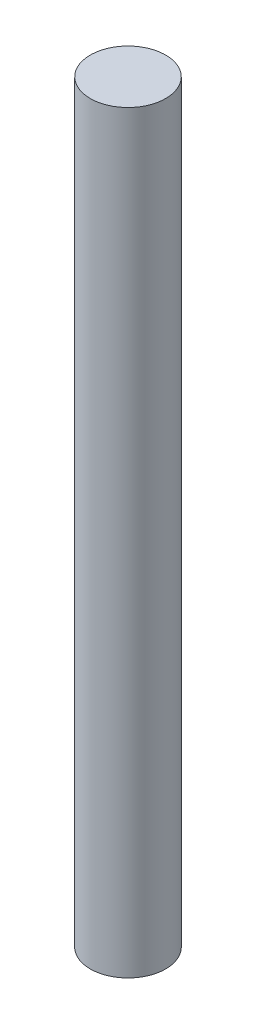
ISO-10303-21;
HEADER;
FILE_DESCRIPTION(('STEP AP214'),'2;1');
FILE_NAME('part.step','',(''),(''),'','','');
FILE_SCHEMA(('AUTOMOTIVE_DESIGN { 1 0 10303 214 1 1 1 1 }'));
ENDSEC;
DATA;
#1=APPLICATION_CONTEXT('core data for automotive mechanical design processes');
#2=APPLICATION_PROTOCOL_DEFINITION('international standard','automotive_design',2000,#1);
#3=PRODUCT_CONTEXT('',#1,'mechanical');
#4=PRODUCT('Part','Part','',(#3));
#5=PRODUCT_RELATED_PRODUCT_CATEGORY('part','',(#4));
#6=PRODUCT_DEFINITION_FORMATION('','',#4);
#7=PRODUCT_DEFINITION_CONTEXT('part definition',#1,'design');
#8=PRODUCT_DEFINITION('design','',#6,#7);
#9=PRODUCT_DEFINITION_SHAPE('','',#8);
#10=(LENGTH_UNIT() NAMED_UNIT(*) SI_UNIT(.MILLI.,.METRE.));
#11=(NAMED_UNIT(*) PLANE_ANGLE_UNIT() SI_UNIT($,.RADIAN.));
#12=(NAMED_UNIT(*) SI_UNIT($,.STERADIAN.) SOLID_ANGLE_UNIT());
#13=UNCERTAINTY_MEASURE_WITH_UNIT(LENGTH_MEASURE(1.E-05),#10,'distance_accuracy_value','');
#14=(GEOMETRIC_REPRESENTATION_CONTEXT(3) GLOBAL_UNCERTAINTY_ASSIGNED_CONTEXT((#13)) GLOBAL_UNIT_ASSIGNED_CONTEXT((#10,
#11,#12)) REPRESENTATION_CONTEXT('',''));
#15=CARTESIAN_POINT('',(0.,0.,0.));
#16=DIRECTION('',(0.,0.,1.));
#17=DIRECTION('',(1.,0.,0.));
#18=AXIS2_PLACEMENT_3D('',#15,#16,#17);
#19=CARTESIAN_POINT('',(0.,50.,0.));
#20=DIRECTION('',(0.,-1.,0.));
#21=DIRECTION('',(0.,0.,-1.));
#22=AXIS2_PLACEMENT_3D('',#19,#20,#21);
#23=CYLINDRICAL_SURFACE('',#22,2.5);
#24=CARTESIAN_POINT('',(0.,50.,0.));
#25=DIRECTION('',(0.,1.,0.));
#26=DIRECTION('',(0.,0.,1.));
#27=AXIS2_PLACEMENT_3D('',#24,#25,#26);
#28=CIRCLE('',#27,2.5);
#29=CARTESIAN_POINT('',(0.,50.,2.5));
#30=VERTEX_POINT('',#29);
#31=EDGE_CURVE('E11',#30,#30,#28,.T.);
#32=ORIENTED_EDGE('',*,*,#31,.F.);
#33=EDGE_LOOP('',(#32));
#34=FACE_BOUND('',#33,.T.);
#35=CARTESIAN_POINT('',(0.,0.,0.));
#36=DIRECTION('',(0.,1.,0.));
#37=DIRECTION('',(0.,0.,1.));
#38=AXIS2_PLACEMENT_3D('',#35,#36,#37);
#39=CIRCLE('',#38,2.5);
#40=CARTESIAN_POINT('',(0.,0.,2.5));
#41=VERTEX_POINT('',#40);
#42=EDGE_CURVE('E42',#41,#41,#39,.T.);
#43=ORIENTED_EDGE('',*,*,#42,.T.);
#44=EDGE_LOOP('',(#43));
#45=FACE_BOUND('',#44,.T.);
#46=ADVANCED_FACE('F39',(#34,#45),#23,.T.);
#47=CARTESIAN_POINT('',(0.,50.,0.));
#48=DIRECTION('',(0.,1.,0.));
#49=DIRECTION('',(0.,0.,1.));
#50=AXIS2_PLACEMENT_3D('',#47,#48,#49);
#51=PLANE('',#50);
#52=ORIENTED_EDGE('',*,*,#31,.T.);
#53=EDGE_LOOP('',(#52));
#54=FACE_BOUND('',#53,.T.);
#55=ADVANCED_FACE('F69',(#54),#51,.T.);
#56=CARTESIAN_POINT('',(0.,0.,0.));
#57=DIRECTION('',(0.,1.,0.));
#58=DIRECTION('',(0.,0.,1.));
#59=AXIS2_PLACEMENT_3D('',#56,#57,#58);
#60=PLANE('',#59);
#61=CARTESIAN_POINT('',(0.,0.,0.));
#62=DIRECTION('',(0.,-1.,0.));
#63=DIRECTION('',(0.,0.,-1.));
#64=AXIS2_PLACEMENT_3D('',#61,#62,#63);
#65=CIRCLE('',#64,1.5);
#66=CARTESIAN_POINT('',(0.,0.,-1.5));
#67=VERTEX_POINT('',#66);
#68=EDGE_CURVE('E51',#67,#67,#65,.T.);
#69=ORIENTED_EDGE('',*,*,#68,.F.);
#70=EDGE_LOOP('',(#69));
#71=FACE_BOUND('',#70,.T.);
#72=ORIENTED_EDGE('',*,*,#42,.F.);
#73=EDGE_LOOP('',(#72));
#74=FACE_BOUND('',#73,.T.);
#75=ADVANCED_FACE('F61',(#71,#74),#60,.F.);
#76=CARTESIAN_POINT('',(0.,9.,0.));
#77=DIRECTION('',(0.,-1.,0.));
#78=DIRECTION('',(0.,0.,-1.));
#79=AXIS2_PLACEMENT_3D('',#76,#77,#78);
#80=CYLINDRICAL_SURFACE('',#79,1.5);
#81=ORIENTED_EDGE('',*,*,#68,.T.);
#82=EDGE_LOOP('',(#81));
#83=FACE_BOUND('',#82,.T.);
#84=CARTESIAN_POINT('',(0.,9.,0.));
#85=DIRECTION('',(0.,-1.,0.));
#86=DIRECTION('',(0.,0.,-1.));
#87=AXIS2_PLACEMENT_3D('',#84,#85,#86);
#88=CIRCLE('',#87,1.5);
#89=CARTESIAN_POINT('',(0.,9.,-1.5));
#90=VERTEX_POINT('',#89);
#91=EDGE_CURVE('E49',#90,#90,#88,.T.);
#92=ORIENTED_EDGE('',*,*,#91,.F.);
#93=EDGE_LOOP('',(#92));
#94=FACE_BOUND('',#93,.T.);
#95=ADVANCED_FACE('F59',(#83,#94),#80,.F.);
#96=CARTESIAN_POINT('',(0.,9.,0.));
#97=DIRECTION('',(0.,-1.,0.));
#98=DIRECTION('',(0.,0.,-1.));
#99=AXIS2_PLACEMENT_3D('',#96,#97,#98);
#100=PLANE('',#99);
#101=ORIENTED_EDGE('',*,*,#91,.T.);
#102=EDGE_LOOP('',(#101));
#103=FACE_BOUND('',#102,.T.);
#104=ADVANCED_FACE('F57',(#103),#100,.T.);
#105=CLOSED_SHELL('',(#46,#55,#75,#95,#104));
#106=MANIFOLD_SOLID_BREP('B2',#105);
#107=ADVANCED_BREP_SHAPE_REPRESENTATION('',(#18,#106),#14);
#108=SHAPE_DEFINITION_REPRESENTATION(#9,#107);
ENDSEC;
END-ISO-10303-21;
